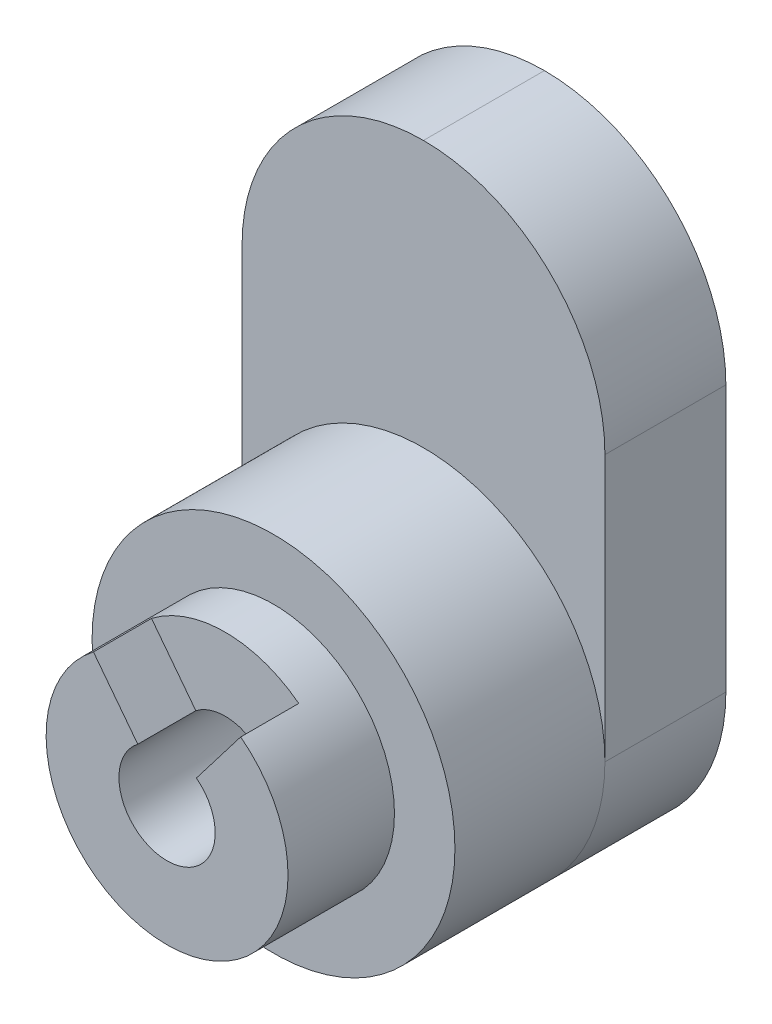
ISO-10303-21;
HEADER;
FILE_DESCRIPTION(('STEP AP214'),'2;1');
FILE_NAME('part.step','',(''),(''),'','','');
FILE_SCHEMA(('AUTOMOTIVE_DESIGN { 1 0 10303 214 1 1 1 1 }'));
ENDSEC;
DATA;
#1=APPLICATION_CONTEXT('core data for automotive mechanical design processes');
#2=APPLICATION_PROTOCOL_DEFINITION('international standard','automotive_design',2000,#1);
#3=PRODUCT_CONTEXT('',#1,'mechanical');
#4=PRODUCT('Part','Part','',(#3));
#5=PRODUCT_RELATED_PRODUCT_CATEGORY('part','',(#4));
#6=PRODUCT_DEFINITION_FORMATION('','',#4);
#7=PRODUCT_DEFINITION_CONTEXT('part definition',#1,'design');
#8=PRODUCT_DEFINITION('design','',#6,#7);
#9=PRODUCT_DEFINITION_SHAPE('','',#8);
#10=(LENGTH_UNIT() NAMED_UNIT(*) SI_UNIT(.MILLI.,.METRE.));
#11=(NAMED_UNIT(*) PLANE_ANGLE_UNIT() SI_UNIT($,.RADIAN.));
#12=(NAMED_UNIT(*) SI_UNIT($,.STERADIAN.) SOLID_ANGLE_UNIT());
#13=UNCERTAINTY_MEASURE_WITH_UNIT(LENGTH_MEASURE(1.E-05),#10,'distance_accuracy_value','');
#14=(GEOMETRIC_REPRESENTATION_CONTEXT(3) GLOBAL_UNCERTAINTY_ASSIGNED_CONTEXT((#13)) GLOBAL_UNIT_ASSIGNED_CONTEXT((#10,
#11,#12)) REPRESENTATION_CONTEXT('',''));
#15=CARTESIAN_POINT('',(0.,0.,0.));
#16=DIRECTION('',(0.,0.,1.));
#17=DIRECTION('',(1.,0.,0.));
#18=AXIS2_PLACEMENT_3D('',#15,#16,#17);
#19=CARTESIAN_POINT('',(0.,0.,6.35));
#20=DIRECTION('',(0.,0.,-1.));
#21=DIRECTION('',(-1.,0.,0.));
#22=AXIS2_PLACEMENT_3D('',#19,#20,#21);
#23=PLANE('',#22);
#24=DIRECTION('',(0.,1.,0.));
#25=VECTOR('',#24,1.);
#26=CARTESIAN_POINT('',(9.525,0.,6.35));
#27=LINE('',#26,#25);
#28=CARTESIAN_POINT('',(9.525,9.525,6.35));
#29=VERTEX_POINT('',#28);
#30=CARTESIAN_POINT('',(9.525,23.495,6.35));
#31=VERTEX_POINT('',#30);
#32=EDGE_CURVE('E286',#29,#31,#27,.T.);
#33=ORIENTED_EDGE('',*,*,#32,.T.);
#34=CARTESIAN_POINT('',(0.,23.495,6.35));
#35=DIRECTION('',(0.,0.,-1.));
#36=DIRECTION('',(-1.,0.,0.));
#37=AXIS2_PLACEMENT_3D('',#34,#35,#36);
#38=CIRCLE('',#37,9.525);
#39=CARTESIAN_POINT('',(0.,33.02,6.35));
#40=VERTEX_POINT('',#39);
#41=EDGE_CURVE('E66',#31,#40,#38,.F.);
#42=ORIENTED_EDGE('',*,*,#41,.T.);
#43=CARTESIAN_POINT('',(0.,23.495,6.35));
#44=DIRECTION('',(0.,0.,-1.));
#45=DIRECTION('',(-1.,0.,0.));
#46=AXIS2_PLACEMENT_3D('',#43,#44,#45);
#47=CIRCLE('',#46,9.525);
#48=CARTESIAN_POINT('',(-9.525,23.495,6.35));
#49=VERTEX_POINT('',#48);
#50=EDGE_CURVE('E61',#40,#49,#47,.F.);
#51=ORIENTED_EDGE('',*,*,#50,.T.);
#52=DIRECTION('',(0.,-1.,0.));
#53=VECTOR('',#52,1.);
#54=CARTESIAN_POINT('',(-9.525,0.,6.35));
#55=LINE('',#54,#53);
#56=CARTESIAN_POINT('',(-9.525,9.525,6.35));
#57=VERTEX_POINT('',#56);
#58=EDGE_CURVE('E283',#49,#57,#55,.T.);
#59=ORIENTED_EDGE('',*,*,#58,.T.);
#60=CARTESIAN_POINT('',(0.,9.525,6.35));
#61=DIRECTION('',(0.,0.,1.));
#62=DIRECTION('',(1.,0.,0.));
#63=AXIS2_PLACEMENT_3D('',#60,#61,#62);
#64=CIRCLE('',#63,9.525);
#65=EDGE_CURVE('E205',#29,#57,#64,.T.);
#66=ORIENTED_EDGE('',*,*,#65,.F.);
#67=EDGE_LOOP('',(#33,#42,#51,#59,#66));
#68=FACE_BOUND('',#67,.T.);
#69=ADVANCED_FACE('F43',(#68),#23,.F.);
#70=CARTESIAN_POINT('',(0.,9.525,19.812));
#71=DIRECTION('',(0.,0.,1.));
#72=DIRECTION('',(1.,0.,0.));
#73=AXIS2_PLACEMENT_3D('',#70,#71,#72);
#74=CYLINDRICAL_SURFACE('',#73,2.5273);
#75=CARTESIAN_POINT('',(0.,9.525,16.764));
#76=DIRECTION('',(0.,0.,-1.));
#77=DIRECTION('',(1.,0.,0.));
#78=AXIS2_PLACEMENT_3D('',#75,#76,#77);
#79=CIRCLE('',#78,2.5273);
#80=CARTESIAN_POINT('',(-1.53852275953374,11.530041896918,16.764));
#81=VERTEX_POINT('',#80);
#82=CARTESIAN_POINT('',(1.53852275953374,11.530041896918,16.764));
#83=VERTEX_POINT('',#82);
#84=EDGE_CURVE('E168',#81,#83,#79,.T.);
#85=ORIENTED_EDGE('',*,*,#84,.F.);
#86=DIRECTION('',(0.,0.,1.));
#87=VECTOR('',#86,1.);
#88=CARTESIAN_POINT('',(-1.53852275953374,11.530041896918,16.764));
#89=LINE('',#88,#87);
#90=CARTESIAN_POINT('',(-1.53852275953374,11.530041896918,19.812));
#91=VERTEX_POINT('',#90);
#92=EDGE_CURVE('E199',#81,#91,#89,.T.);
#93=ORIENTED_EDGE('',*,*,#92,.T.);
#94=CARTESIAN_POINT('',(0.,9.525,19.812));
#95=DIRECTION('',(0.,0.,1.));
#96=DIRECTION('',(1.,0.,0.));
#97=AXIS2_PLACEMENT_3D('',#94,#95,#96);
#98=CIRCLE('',#97,2.5273);
#99=CARTESIAN_POINT('',(1.53852275953374,11.530041896918,19.812));
#100=VERTEX_POINT('',#99);
#101=EDGE_CURVE('E184',#91,#100,#98,.T.);
#102=ORIENTED_EDGE('',*,*,#101,.T.);
#103=DIRECTION('',(0.,0.,1.));
#104=VECTOR('',#103,1.);
#105=CARTESIAN_POINT('',(1.53852275953374,11.530041896918,16.764));
#106=LINE('',#105,#104);
#107=EDGE_CURVE('E160',#83,#100,#106,.T.);
#108=ORIENTED_EDGE('',*,*,#107,.F.);
#109=EDGE_LOOP('',(#85,#93,#102,#108));
#110=FACE_BOUND('',#109,.T.);
#111=CARTESIAN_POINT('',(0.,9.525,2.54));
#112=DIRECTION('',(0.,0.,-1.));
#113=DIRECTION('',(-1.,0.,0.));
#114=AXIS2_PLACEMENT_3D('',#111,#112,#113);
#115=CIRCLE('',#114,2.5273);
#116=CARTESIAN_POINT('',(-2.5273,9.525,2.54));
#117=VERTEX_POINT('',#116);
#118=EDGE_CURVE('E260',#117,#117,#115,.F.);
#119=ORIENTED_EDGE('',*,*,#118,.F.);
#120=EDGE_LOOP('',(#119));
#121=FACE_BOUND('',#120,.T.);
#122=ADVANCED_FACE('F181',(#110,#121),#74,.F.);
#123=CARTESIAN_POINT('',(-9.525,0.,6.35));
#124=DIRECTION('',(1.,0.,0.));
#125=DIRECTION('',(0.,0.,-1.));
#126=AXIS2_PLACEMENT_3D('',#123,#124,#125);
#127=PLANE('',#126);
#128=ORIENTED_EDGE('',*,*,#58,.F.);
#129=DIRECTION('',(0.,0.,-1.));
#130=VECTOR('',#129,1.);
#131=CARTESIAN_POINT('',(-9.525,23.495,6.35));
#132=LINE('',#131,#130);
#133=CARTESIAN_POINT('',(-9.525,23.495,0.));
#134=VERTEX_POINT('',#133);
#135=EDGE_CURVE('E11',#49,#134,#132,.T.);
#136=ORIENTED_EDGE('',*,*,#135,.T.);
#137=DIRECTION('',(0.,-1.,0.));
#138=VECTOR('',#137,1.);
#139=CARTESIAN_POINT('',(-9.525,0.,0.));
#140=LINE('',#139,#138);
#141=CARTESIAN_POINT('',(-9.525,9.525,0.));
#142=VERTEX_POINT('',#141);
#143=EDGE_CURVE('E282',#134,#142,#140,.T.);
#144=ORIENTED_EDGE('',*,*,#143,.T.);
#145=DIRECTION('',(0.,0.,-1.));
#146=VECTOR('',#145,1.);
#147=CARTESIAN_POINT('',(-9.525,9.525,6.35));
#148=LINE('',#147,#146);
#149=EDGE_CURVE('E53',#142,#57,#148,.F.);
#150=ORIENTED_EDGE('',*,*,#149,.T.);
#151=EDGE_LOOP('',(#128,#136,#144,#150));
#152=FACE_BOUND('',#151,.T.);
#153=ADVANCED_FACE('F351',(#152),#127,.F.);
#154=CARTESIAN_POINT('',(9.525,0.,6.35));
#155=DIRECTION('',(-1.,0.,0.));
#156=DIRECTION('',(0.,0.,1.));
#157=AXIS2_PLACEMENT_3D('',#154,#155,#156);
#158=PLANE('',#157);
#159=DIRECTION('',(0.,1.,0.));
#160=VECTOR('',#159,1.);
#161=CARTESIAN_POINT('',(9.525,0.,0.));
#162=LINE('',#161,#160);
#163=CARTESIAN_POINT('',(9.525,9.525,0.));
#164=VERTEX_POINT('',#163);
#165=CARTESIAN_POINT('',(9.525,23.495,0.));
#166=VERTEX_POINT('',#165);
#167=EDGE_CURVE('E287',#164,#166,#162,.T.);
#168=ORIENTED_EDGE('',*,*,#167,.T.);
#169=DIRECTION('',(0.,0.,-1.));
#170=VECTOR('',#169,1.);
#171=CARTESIAN_POINT('',(9.525,23.495,6.35));
#172=LINE('',#171,#170);
#173=EDGE_CURVE('E315',#166,#31,#172,.F.);
#174=ORIENTED_EDGE('',*,*,#173,.T.);
#175=ORIENTED_EDGE('',*,*,#32,.F.);
#176=DIRECTION('',(0.,0.,-1.));
#177=VECTOR('',#176,1.);
#178=CARTESIAN_POINT('',(9.525,9.525,6.35));
#179=LINE('',#178,#177);
#180=EDGE_CURVE('E311',#29,#164,#179,.T.);
#181=ORIENTED_EDGE('',*,*,#180,.T.);
#182=EDGE_LOOP('',(#168,#174,#175,#181));
#183=FACE_BOUND('',#182,.T.);
#184=ADVANCED_FACE('F357',(#183),#158,.F.);
#185=CARTESIAN_POINT('',(0.,0.,0.));
#186=DIRECTION('',(0.,0.,-1.));
#187=DIRECTION('',(-1.,0.,0.));
#188=AXIS2_PLACEMENT_3D('',#185,#186,#187);
#189=PLANE('',#188);
#190=DIRECTION('',(-1.,0.,0.));
#191=VECTOR('',#190,1.);
#192=CARTESIAN_POINT('',(2.34635149398664,5.461,0.));
#193=LINE('',#192,#191);
#194=CARTESIAN_POINT('',(2.34635149398664,5.461,0.));
#195=VERTEX_POINT('',#194);
#196=CARTESIAN_POINT('',(-2.34635149398664,5.461,0.));
#197=VERTEX_POINT('',#196);
#198=EDGE_CURVE('E204',#195,#197,#193,.T.);
#199=ORIENTED_EDGE('',*,*,#198,.F.);
#200=DIRECTION('',(-0.5,-0.866025403784439,0.));
#201=VECTOR('',#200,1.);
#202=CARTESIAN_POINT('',(4.69270298797328,9.525,0.));
#203=LINE('',#202,#201);
#204=CARTESIAN_POINT('',(4.69270298797328,9.525,0.));
#205=VERTEX_POINT('',#204);
#206=EDGE_CURVE('E215',#205,#195,#203,.T.);
#207=ORIENTED_EDGE('',*,*,#206,.F.);
#208=DIRECTION('',(0.5,-0.866025403784439,0.));
#209=VECTOR('',#208,1.);
#210=CARTESIAN_POINT('',(2.34635149398664,13.589,0.));
#211=LINE('',#210,#209);
#212=CARTESIAN_POINT('',(2.34635149398664,13.589,0.));
#213=VERTEX_POINT('',#212);
#214=EDGE_CURVE('E250',#213,#205,#211,.T.);
#215=ORIENTED_EDGE('',*,*,#214,.F.);
#216=DIRECTION('',(1.,0.,0.));
#217=VECTOR('',#216,1.);
#218=CARTESIAN_POINT('',(-2.34635149398664,13.589,0.));
#219=LINE('',#218,#217);
#220=CARTESIAN_POINT('',(-2.34635149398664,13.589,0.));
#221=VERTEX_POINT('',#220);
#222=EDGE_CURVE('E246',#221,#213,#219,.T.);
#223=ORIENTED_EDGE('',*,*,#222,.F.);
#224=DIRECTION('',(0.5,0.866025403784439,0.));
#225=VECTOR('',#224,1.);
#226=CARTESIAN_POINT('',(-4.69270298797328,9.525,0.));
#227=LINE('',#226,#225);
#228=CARTESIAN_POINT('',(-4.69270298797328,9.525,0.));
#229=VERTEX_POINT('',#228);
#230=EDGE_CURVE('E242',#229,#221,#227,.T.);
#231=ORIENTED_EDGE('',*,*,#230,.F.);
#232=DIRECTION('',(-0.5,0.866025403784439,0.));
#233=VECTOR('',#232,1.);
#234=CARTESIAN_POINT('',(-2.34635149398664,5.461,0.));
#235=LINE('',#234,#233);
#236=EDGE_CURVE('E238',#197,#229,#235,.T.);
#237=ORIENTED_EDGE('',*,*,#236,.F.);
#238=EDGE_LOOP('',(#199,#207,#215,#223,#231,#237));
#239=FACE_BOUND('',#238,.T.);
#240=CARTESIAN_POINT('',(0.,23.495,0.));
#241=DIRECTION('',(0.,0.,-1.));
#242=DIRECTION('',(-1.,0.,0.));
#243=AXIS2_PLACEMENT_3D('',#240,#241,#242);
#244=CIRCLE('',#243,9.525);
#245=CARTESIAN_POINT('',(0.,33.02,0.));
#246=VERTEX_POINT('',#245);
#247=EDGE_CURVE('E305',#134,#246,#244,.T.);
#248=ORIENTED_EDGE('',*,*,#247,.T.);
#249=CARTESIAN_POINT('',(0.,23.495,0.));
#250=DIRECTION('',(0.,0.,-1.));
#251=DIRECTION('',(-1.,0.,0.));
#252=AXIS2_PLACEMENT_3D('',#249,#250,#251);
#253=CIRCLE('',#252,9.525);
#254=EDGE_CURVE('E308',#246,#166,#253,.T.);
#255=ORIENTED_EDGE('',*,*,#254,.T.);
#256=ORIENTED_EDGE('',*,*,#167,.F.);
#257=CARTESIAN_POINT('',(0.,9.525,0.));
#258=DIRECTION('',(0.,0.,-1.));
#259=DIRECTION('',(-1.,0.,0.));
#260=AXIS2_PLACEMENT_3D('',#257,#258,#259);
#261=CIRCLE('',#260,9.525);
#262=CARTESIAN_POINT('',(0.,0.,0.));
#263=VERTEX_POINT('',#262);
#264=EDGE_CURVE('E302',#164,#263,#261,.T.);
#265=ORIENTED_EDGE('',*,*,#264,.T.);
#266=CARTESIAN_POINT('',(0.,9.525,0.));
#267=DIRECTION('',(0.,0.,-1.));
#268=DIRECTION('',(-1.,0.,0.));
#269=AXIS2_PLACEMENT_3D('',#266,#267,#268);
#270=CIRCLE('',#269,9.525);
#271=EDGE_CURVE('E290',#263,#142,#270,.T.);
#272=ORIENTED_EDGE('',*,*,#271,.T.);
#273=ORIENTED_EDGE('',*,*,#143,.F.);
#274=EDGE_LOOP('',(#248,#255,#256,#265,#272,#273));
#275=FACE_BOUND('',#274,.T.);
#276=ADVANCED_FACE('F347',(#239,#275),#189,.T.);
#277=CARTESIAN_POINT('',(0.,9.525,19.812));
#278=DIRECTION('',(0.,0.,-1.));
#279=DIRECTION('',(-1.,0.,0.));
#280=AXIS2_PLACEMENT_3D('',#277,#278,#279);
#281=CYLINDRICAL_SURFACE('',#280,6.35);
#282=CARTESIAN_POINT('',(0.,9.525,19.812));
#283=DIRECTION('',(0.,0.,1.));
#284=DIRECTION('',(1.,0.,0.));
#285=AXIS2_PLACEMENT_3D('',#282,#283,#284);
#286=CIRCLE('',#285,6.35);
#287=CARTESIAN_POINT('',(-3.86563507420537,14.5627937108493,19.812));
#288=VERTEX_POINT('',#287);
#289=CARTESIAN_POINT('',(3.86563507420537,14.5627937108493,19.812));
#290=VERTEX_POINT('',#289);
#291=EDGE_CURVE('E278',#288,#290,#286,.T.);
#292=ORIENTED_EDGE('',*,*,#291,.F.);
#293=DIRECTION('',(0.,0.,1.));
#294=VECTOR('',#293,1.);
#295=CARTESIAN_POINT('',(-3.86563507420537,14.5627937108493,16.764));
#296=LINE('',#295,#294);
#297=CARTESIAN_POINT('',(-3.86563507420537,14.5627937108493,16.764));
#298=VERTEX_POINT('',#297);
#299=EDGE_CURVE('E189',#298,#288,#296,.T.);
#300=ORIENTED_EDGE('',*,*,#299,.F.);
#301=CARTESIAN_POINT('',(0.,9.525,16.764));
#302=DIRECTION('',(0.,0.,1.));
#303=DIRECTION('',(1.,0.,0.));
#304=AXIS2_PLACEMENT_3D('',#301,#302,#303);
#305=CIRCLE('',#304,6.35);
#306=CARTESIAN_POINT('',(3.86563507420537,14.5627937108493,16.764));
#307=VERTEX_POINT('',#306);
#308=EDGE_CURVE('E167',#307,#298,#305,.T.);
#309=ORIENTED_EDGE('',*,*,#308,.F.);
#310=DIRECTION('',(0.,0.,1.));
#311=VECTOR('',#310,1.);
#312=CARTESIAN_POINT('',(3.86563507420537,14.5627937108493,16.764));
#313=LINE('',#312,#311);
#314=EDGE_CURVE('E163',#307,#290,#313,.T.);
#315=ORIENTED_EDGE('',*,*,#314,.T.);
#316=EDGE_LOOP('',(#292,#300,#309,#315));
#317=FACE_BOUND('',#316,.T.);
#318=CARTESIAN_POINT('',(0.,9.525,14.224));
#319=DIRECTION('',(0.,0.,1.));
#320=DIRECTION('',(1.,0.,0.));
#321=AXIS2_PLACEMENT_3D('',#318,#319,#320);
#322=CIRCLE('',#321,6.35);
#323=CARTESIAN_POINT('',(6.35,9.525,14.224));
#324=VERTEX_POINT('',#323);
#325=EDGE_CURVE('E194',#324,#324,#322,.T.);
#326=ORIENTED_EDGE('',*,*,#325,.T.);
#327=EDGE_LOOP('',(#326));
#328=FACE_BOUND('',#327,.T.);
#329=ADVANCED_FACE('F376',(#317,#328),#281,.T.);
#330=CARTESIAN_POINT('',(0.,9.525,19.812));
#331=DIRECTION('',(0.,0.,1.));
#332=DIRECTION('',(1.,0.,0.));
#333=AXIS2_PLACEMENT_3D('',#330,#331,#332);
#334=PLANE('',#333);
#335=DIRECTION('',(0.608761429008719,-0.793353340291237,0.));
#336=VECTOR('',#335,1.);
#337=CARTESIAN_POINT('',(-3.86563507420537,14.5627937108493,19.812));
#338=LINE('',#337,#336);
#339=EDGE_CURVE('E178',#288,#91,#338,.T.);
#340=ORIENTED_EDGE('',*,*,#339,.F.);
#341=ORIENTED_EDGE('',*,*,#291,.T.);
#342=DIRECTION('',(0.608761429008719,0.793353340291237,0.));
#343=VECTOR('',#342,1.);
#344=CARTESIAN_POINT('',(1.53852275953374,11.530041896918,19.812));
#345=LINE('',#344,#343);
#346=EDGE_CURVE('E327',#100,#290,#345,.T.);
#347=ORIENTED_EDGE('',*,*,#346,.F.);
#348=ORIENTED_EDGE('',*,*,#101,.F.);
#349=EDGE_LOOP('',(#340,#341,#347,#348));
#350=FACE_BOUND('',#349,.T.);
#351=ADVANCED_FACE('F402',(#350),#334,.T.);
#352=CARTESIAN_POINT('',(0.,0.,2.54));
#353=DIRECTION('',(0.,0.,-1.));
#354=DIRECTION('',(-1.,0.,0.));
#355=AXIS2_PLACEMENT_3D('',#352,#353,#354);
#356=PLANE('',#355);
#357=DIRECTION('',(-1.,0.,0.));
#358=VECTOR('',#357,1.);
#359=CARTESIAN_POINT('',(2.34635149398664,5.461,2.54));
#360=LINE('',#359,#358);
#361=CARTESIAN_POINT('',(2.34635149398664,5.461,2.54));
#362=VERTEX_POINT('',#361);
#363=CARTESIAN_POINT('',(-2.34635149398664,5.461,2.54));
#364=VERTEX_POINT('',#363);
#365=EDGE_CURVE('E210',#362,#364,#360,.T.);
#366=ORIENTED_EDGE('',*,*,#365,.T.);
#367=DIRECTION('',(-0.5,0.866025403784439,0.));
#368=VECTOR('',#367,1.);
#369=CARTESIAN_POINT('',(-2.34635149398664,5.461,2.54));
#370=LINE('',#369,#368);
#371=CARTESIAN_POINT('',(-4.69270298797328,9.525,2.54));
#372=VERTEX_POINT('',#371);
#373=EDGE_CURVE('E214',#364,#372,#370,.T.);
#374=ORIENTED_EDGE('',*,*,#373,.T.);
#375=DIRECTION('',(0.5,0.866025403784439,0.));
#376=VECTOR('',#375,1.);
#377=CARTESIAN_POINT('',(-4.69270298797328,9.525,2.54));
#378=LINE('',#377,#376);
#379=CARTESIAN_POINT('',(-2.34635149398664,13.589,2.54));
#380=VERTEX_POINT('',#379);
#381=EDGE_CURVE('E219',#372,#380,#378,.T.);
#382=ORIENTED_EDGE('',*,*,#381,.T.);
#383=DIRECTION('',(1.,0.,0.));
#384=VECTOR('',#383,1.);
#385=CARTESIAN_POINT('',(-2.34635149398664,13.589,2.54));
#386=LINE('',#385,#384);
#387=CARTESIAN_POINT('',(2.34635149398664,13.589,2.54));
#388=VERTEX_POINT('',#387);
#389=EDGE_CURVE('E223',#380,#388,#386,.T.);
#390=ORIENTED_EDGE('',*,*,#389,.T.);
#391=DIRECTION('',(0.5,-0.866025403784439,0.));
#392=VECTOR('',#391,1.);
#393=CARTESIAN_POINT('',(2.34635149398664,13.589,2.54));
#394=LINE('',#393,#392);
#395=CARTESIAN_POINT('',(4.69270298797328,9.525,2.54));
#396=VERTEX_POINT('',#395);
#397=EDGE_CURVE('E227',#388,#396,#394,.T.);
#398=ORIENTED_EDGE('',*,*,#397,.T.);
#399=DIRECTION('',(-0.5,-0.866025403784439,0.));
#400=VECTOR('',#399,1.);
#401=CARTESIAN_POINT('',(4.69270298797328,9.525,2.54));
#402=LINE('',#401,#400);
#403=EDGE_CURVE('E231',#396,#362,#402,.T.);
#404=ORIENTED_EDGE('',*,*,#403,.T.);
#405=EDGE_LOOP('',(#366,#374,#382,#390,#398,#404));
#406=FACE_BOUND('',#405,.T.);
#407=ORIENTED_EDGE('',*,*,#118,.T.);
#408=EDGE_LOOP('',(#407));
#409=FACE_BOUND('',#408,.T.);
#410=ADVANCED_FACE('F409',(#406,#409),#356,.T.);
#411=CARTESIAN_POINT('',(2.34635149398664,5.461,2.54));
#412=DIRECTION('',(0.,-1.,0.));
#413=DIRECTION('',(0.,0.,-1.));
#414=AXIS2_PLACEMENT_3D('',#411,#412,#413);
#415=PLANE('',#414);
#416=ORIENTED_EDGE('',*,*,#198,.T.);
#417=DIRECTION('',(0.,0.,-1.));
#418=VECTOR('',#417,1.);
#419=CARTESIAN_POINT('',(-2.34635149398664,5.461,2.54));
#420=LINE('',#419,#418);
#421=EDGE_CURVE('E235',#364,#197,#420,.T.);
#422=ORIENTED_EDGE('',*,*,#421,.F.);
#423=ORIENTED_EDGE('',*,*,#365,.F.);
#424=DIRECTION('',(0.,0.,-1.));
#425=VECTOR('',#424,1.);
#426=CARTESIAN_POINT('',(2.34635149398664,5.461,2.54));
#427=LINE('',#426,#425);
#428=EDGE_CURVE('E257',#362,#195,#427,.T.);
#429=ORIENTED_EDGE('',*,*,#428,.T.);
#430=EDGE_LOOP('',(#416,#422,#423,#429));
#431=FACE_BOUND('',#430,.T.);
#432=ADVANCED_FACE('F417',(#431),#415,.F.);
#433=CARTESIAN_POINT('',(4.69270298797328,9.525,2.54));
#434=DIRECTION('',(0.866025403784439,-0.5,0.));
#435=DIRECTION('',(0.5,0.866025403784439,0.));
#436=AXIS2_PLACEMENT_3D('',#433,#434,#435);
#437=PLANE('',#436);
#438=ORIENTED_EDGE('',*,*,#206,.T.);
#439=ORIENTED_EDGE('',*,*,#428,.F.);
#440=ORIENTED_EDGE('',*,*,#403,.F.);
#441=DIRECTION('',(0.,0.,-1.));
#442=VECTOR('',#441,1.);
#443=CARTESIAN_POINT('',(4.69270298797328,9.525,2.54));
#444=LINE('',#443,#442);
#445=EDGE_CURVE('E261',#396,#205,#444,.T.);
#446=ORIENTED_EDGE('',*,*,#445,.T.);
#447=EDGE_LOOP('',(#438,#439,#440,#446));
#448=FACE_BOUND('',#447,.T.);
#449=ADVANCED_FACE('F425',(#448),#437,.F.);
#450=CARTESIAN_POINT('',(2.34635149398664,13.589,2.54));
#451=DIRECTION('',(0.866025403784439,0.5,0.));
#452=DIRECTION('',(-0.5,0.866025403784439,0.));
#453=AXIS2_PLACEMENT_3D('',#450,#451,#452);
#454=PLANE('',#453);
#455=ORIENTED_EDGE('',*,*,#214,.T.);
#456=ORIENTED_EDGE('',*,*,#445,.F.);
#457=ORIENTED_EDGE('',*,*,#397,.F.);
#458=DIRECTION('',(0.,0.,-1.));
#459=VECTOR('',#458,1.);
#460=CARTESIAN_POINT('',(2.34635149398664,13.589,2.54));
#461=LINE('',#460,#459);
#462=EDGE_CURVE('E264',#388,#213,#461,.T.);
#463=ORIENTED_EDGE('',*,*,#462,.T.);
#464=EDGE_LOOP('',(#455,#456,#457,#463));
#465=FACE_BOUND('',#464,.T.);
#466=ADVANCED_FACE('F433',(#465),#454,.F.);
#467=CARTESIAN_POINT('',(-2.34635149398664,13.589,2.54));
#468=DIRECTION('',(0.,1.,0.));
#469=DIRECTION('',(0.,0.,1.));
#470=AXIS2_PLACEMENT_3D('',#467,#468,#469);
#471=PLANE('',#470);
#472=ORIENTED_EDGE('',*,*,#222,.T.);
#473=ORIENTED_EDGE('',*,*,#462,.F.);
#474=ORIENTED_EDGE('',*,*,#389,.F.);
#475=DIRECTION('',(0.,0.,-1.));
#476=VECTOR('',#475,1.);
#477=CARTESIAN_POINT('',(-2.34635149398664,13.589,2.54));
#478=LINE('',#477,#476);
#479=EDGE_CURVE('E267',#380,#221,#478,.T.);
#480=ORIENTED_EDGE('',*,*,#479,.T.);
#481=EDGE_LOOP('',(#472,#473,#474,#480));
#482=FACE_BOUND('',#481,.T.);
#483=ADVANCED_FACE('F441',(#482),#471,.F.);
#484=CARTESIAN_POINT('',(-4.69270298797328,9.525,2.54));
#485=DIRECTION('',(-0.866025403784439,0.5,0.));
#486=DIRECTION('',(-0.5,-0.866025403784439,0.));
#487=AXIS2_PLACEMENT_3D('',#484,#485,#486);
#488=PLANE('',#487);
#489=ORIENTED_EDGE('',*,*,#230,.T.);
#490=ORIENTED_EDGE('',*,*,#479,.F.);
#491=ORIENTED_EDGE('',*,*,#381,.F.);
#492=DIRECTION('',(0.,0.,-1.));
#493=VECTOR('',#492,1.);
#494=CARTESIAN_POINT('',(-4.69270298797328,9.525,2.54));
#495=LINE('',#494,#493);
#496=EDGE_CURVE('E270',#372,#229,#495,.T.);
#497=ORIENTED_EDGE('',*,*,#496,.T.);
#498=EDGE_LOOP('',(#489,#490,#491,#497));
#499=FACE_BOUND('',#498,.T.);
#500=ADVANCED_FACE('F449',(#499),#488,.F.);
#501=CARTESIAN_POINT('',(-2.34635149398664,5.461,2.54));
#502=DIRECTION('',(-0.866025403784439,-0.5,0.));
#503=DIRECTION('',(0.5,-0.866025403784439,0.));
#504=AXIS2_PLACEMENT_3D('',#501,#502,#503);
#505=PLANE('',#504);
#506=ORIENTED_EDGE('',*,*,#236,.T.);
#507=ORIENTED_EDGE('',*,*,#496,.F.);
#508=ORIENTED_EDGE('',*,*,#373,.F.);
#509=ORIENTED_EDGE('',*,*,#421,.T.);
#510=EDGE_LOOP('',(#506,#507,#508,#509));
#511=FACE_BOUND('',#510,.T.);
#512=ADVANCED_FACE('F457',(#511),#505,.F.);
#513=CARTESIAN_POINT('',(0.,9.525,14.224));
#514=DIRECTION('',(0.,0.,1.));
#515=DIRECTION('',(1.,0.,0.));
#516=AXIS2_PLACEMENT_3D('',#513,#514,#515);
#517=PLANE('',#516);
#518=CARTESIAN_POINT('',(0.,9.525,14.224));
#519=DIRECTION('',(0.,0.,1.));
#520=DIRECTION('',(1.,0.,0.));
#521=AXIS2_PLACEMENT_3D('',#518,#519,#520);
#522=CIRCLE('',#521,9.525);
#523=CARTESIAN_POINT('',(9.525,9.525,14.224));
#524=VERTEX_POINT('',#523);
#525=EDGE_CURVE('E200',#524,#524,#522,.T.);
#526=ORIENTED_EDGE('',*,*,#525,.T.);
#527=EDGE_LOOP('',(#526));
#528=FACE_BOUND('',#527,.T.);
#529=ORIENTED_EDGE('',*,*,#325,.F.);
#530=EDGE_LOOP('',(#529));
#531=FACE_BOUND('',#530,.T.);
#532=ADVANCED_FACE('F465',(#528,#531),#517,.T.);
#533=CARTESIAN_POINT('',(0.,9.525,14.224));
#534=DIRECTION('',(0.,0.,-1.));
#535=DIRECTION('',(-1.,0.,0.));
#536=AXIS2_PLACEMENT_3D('',#533,#534,#535);
#537=CYLINDRICAL_SURFACE('',#536,9.525);
#538=ORIENTED_EDGE('',*,*,#525,.F.);
#539=EDGE_LOOP('',(#538));
#540=FACE_BOUND('',#539,.T.);
#541=ORIENTED_EDGE('',*,*,#65,.T.);
#542=CARTESIAN_POINT('',(0.,0.,6.35));
#543=VERTEX_POINT('',#542);
#544=EDGE_CURVE('E209',#57,#543,#64,.T.);
#545=ORIENTED_EDGE('',*,*,#544,.T.);
#546=EDGE_CURVE('E198',#543,#29,#64,.T.);
#547=ORIENTED_EDGE('',*,*,#546,.T.);
#548=EDGE_LOOP('',(#541,#545,#547));
#549=FACE_BOUND('',#548,.T.);
#550=ADVANCED_FACE('F473',(#540,#549),#537,.T.);
#551=CARTESIAN_POINT('',(-3.86563507420537,14.5627937108493,16.764));
#552=DIRECTION('',(-0.793353340291236,-0.608761429008719,0.));
#553=DIRECTION('',(0.608761429008719,-0.793353340291236,0.));
#554=AXIS2_PLACEMENT_3D('',#551,#552,#553);
#555=PLANE('',#554);
#556=ORIENTED_EDGE('',*,*,#339,.T.);
#557=ORIENTED_EDGE('',*,*,#92,.F.);
#558=DIRECTION('',(0.608761429008719,-0.793353340291237,0.));
#559=VECTOR('',#558,1.);
#560=CARTESIAN_POINT('',(-3.86563507420537,14.5627937108493,16.764));
#561=LINE('',#560,#559);
#562=EDGE_CURVE('E174',#298,#81,#561,.T.);
#563=ORIENTED_EDGE('',*,*,#562,.F.);
#564=ORIENTED_EDGE('',*,*,#299,.T.);
#565=EDGE_LOOP('',(#556,#557,#563,#564));
#566=FACE_BOUND('',#565,.T.);
#567=ADVANCED_FACE('F480',(#566),#555,.F.);
#568=CARTESIAN_POINT('',(1.53852275953374,11.530041896918,16.764));
#569=DIRECTION('',(0.793353340291236,-0.608761429008719,0.));
#570=DIRECTION('',(0.608761429008719,0.793353340291236,0.));
#571=AXIS2_PLACEMENT_3D('',#568,#569,#570);
#572=PLANE('',#571);
#573=ORIENTED_EDGE('',*,*,#346,.T.);
#574=ORIENTED_EDGE('',*,*,#314,.F.);
#575=DIRECTION('',(0.608761429008719,0.793353340291237,0.));
#576=VECTOR('',#575,1.);
#577=CARTESIAN_POINT('',(1.53852275953374,11.530041896918,16.764));
#578=LINE('',#577,#576);
#579=EDGE_CURVE('E156',#83,#307,#578,.T.);
#580=ORIENTED_EDGE('',*,*,#579,.F.);
#581=ORIENTED_EDGE('',*,*,#107,.T.);
#582=EDGE_LOOP('',(#573,#574,#580,#581));
#583=FACE_BOUND('',#582,.T.);
#584=ADVANCED_FACE('F158',(#583),#572,.F.);
#585=CARTESIAN_POINT('',(0.,9.525,16.764));
#586=DIRECTION('',(0.,0.,1.));
#587=DIRECTION('',(1.,0.,0.));
#588=AXIS2_PLACEMENT_3D('',#585,#586,#587);
#589=PLANE('',#588);
#590=ORIENTED_EDGE('',*,*,#84,.T.);
#591=ORIENTED_EDGE('',*,*,#579,.T.);
#592=ORIENTED_EDGE('',*,*,#308,.T.);
#593=ORIENTED_EDGE('',*,*,#562,.T.);
#594=EDGE_LOOP('',(#590,#591,#592,#593));
#595=FACE_BOUND('',#594,.T.);
#596=ADVANCED_FACE('F172',(#595),#589,.T.);
#597=CARTESIAN_POINT('',(0.,23.495,6.35));
#598=DIRECTION('',(0.,0.,-1.));
#599=DIRECTION('',(-1.,0.,0.));
#600=AXIS2_PLACEMENT_3D('',#597,#598,#599);
#601=CYLINDRICAL_SURFACE('',#600,9.525);
#602=ORIENTED_EDGE('',*,*,#135,.F.);
#603=ORIENTED_EDGE('',*,*,#50,.F.);
#604=DIRECTION('',(0.,0.,-1.));
#605=VECTOR('',#604,1.);
#606=CARTESIAN_POINT('',(0.,33.02,6.35));
#607=LINE('',#606,#605);
#608=EDGE_CURVE('E324',#246,#40,#607,.F.);
#609=ORIENTED_EDGE('',*,*,#608,.F.);
#610=ORIENTED_EDGE('',*,*,#247,.F.);
#611=EDGE_LOOP('',(#602,#603,#609,#610));
#612=FACE_BOUND('',#611,.T.);
#613=ADVANCED_FACE('F354',(#612),#601,.T.);
#614=CARTESIAN_POINT('',(0.,23.495,6.35));
#615=DIRECTION('',(0.,0.,-1.));
#616=DIRECTION('',(-1.,0.,0.));
#617=AXIS2_PLACEMENT_3D('',#614,#615,#616);
#618=CYLINDRICAL_SURFACE('',#617,9.525);
#619=ORIENTED_EDGE('',*,*,#41,.F.);
#620=ORIENTED_EDGE('',*,*,#173,.F.);
#621=ORIENTED_EDGE('',*,*,#254,.F.);
#622=ORIENTED_EDGE('',*,*,#608,.T.);
#623=EDGE_LOOP('',(#619,#620,#621,#622));
#624=FACE_BOUND('',#623,.T.);
#625=ADVANCED_FACE('F359',(#624),#618,.T.);
#626=CARTESIAN_POINT('',(0.,9.525,6.35));
#627=DIRECTION('',(0.,0.,-1.));
#628=DIRECTION('',(-1.,0.,0.));
#629=AXIS2_PLACEMENT_3D('',#626,#627,#628);
#630=CYLINDRICAL_SURFACE('',#629,9.525);
#631=DIRECTION('',(0.,0.,-1.));
#632=VECTOR('',#631,1.);
#633=CARTESIAN_POINT('',(0.,0.,6.35));
#634=LINE('',#633,#632);
#635=EDGE_CURVE('E47',#543,#263,#634,.T.);
#636=ORIENTED_EDGE('',*,*,#635,.F.);
#637=ORIENTED_EDGE('',*,*,#544,.F.);
#638=ORIENTED_EDGE('',*,*,#149,.F.);
#639=ORIENTED_EDGE('',*,*,#271,.F.);
#640=EDGE_LOOP('',(#636,#637,#638,#639));
#641=FACE_BOUND('',#640,.T.);
#642=ADVANCED_FACE('F45',(#641),#630,.T.);
#643=CARTESIAN_POINT('',(0.,9.525,6.35));
#644=DIRECTION('',(0.,0.,-1.));
#645=DIRECTION('',(-1.,0.,0.));
#646=AXIS2_PLACEMENT_3D('',#643,#644,#645);
#647=CYLINDRICAL_SURFACE('',#646,9.525);
#648=ORIENTED_EDGE('',*,*,#546,.F.);
#649=ORIENTED_EDGE('',*,*,#635,.T.);
#650=ORIENTED_EDGE('',*,*,#264,.F.);
#651=ORIENTED_EDGE('',*,*,#180,.F.);
#652=EDGE_LOOP('',(#648,#649,#650,#651));
#653=FACE_BOUND('',#652,.T.);
#654=ADVANCED_FACE('F338',(#653),#647,.T.);
#655=CLOSED_SHELL('',(#69,#122,#153,#184,#276,#329,#351,#410,#432,#449,#466,#483,#500,#512,#532,
#550,#567,#584,#596,#613,#625,#642,#654));
#656=MANIFOLD_SOLID_BREP('B2',#655);
#657=ADVANCED_BREP_SHAPE_REPRESENTATION('',(#18,#656),#14);
#658=SHAPE_DEFINITION_REPRESENTATION(#9,#657);
ENDSEC;
END-ISO-10303-21;
